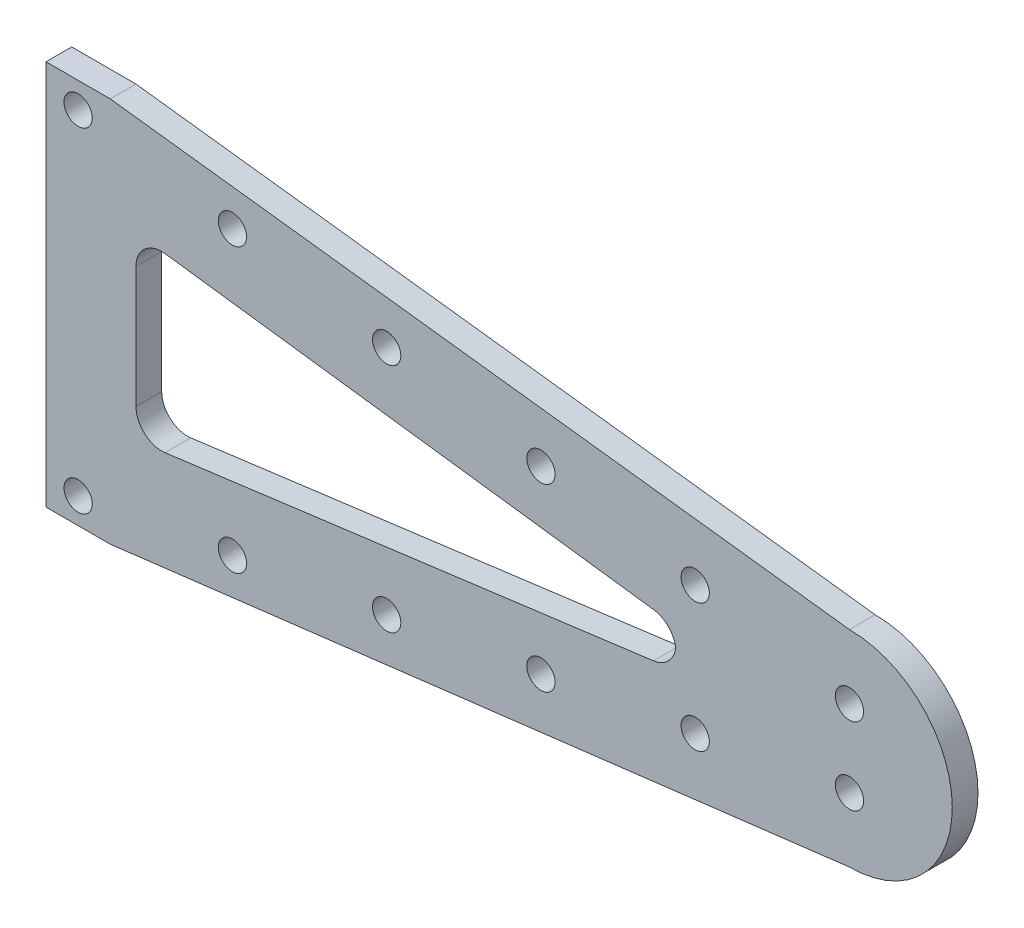
ISO-10303-21;
HEADER;
FILE_DESCRIPTION(('STEP AP214'),'2;1');
FILE_NAME('part.step','',(''),(''),'','','');
FILE_SCHEMA(('AUTOMOTIVE_DESIGN { 1 0 10303 214 1 1 1 1 }'));
ENDSEC;
DATA;
#1=APPLICATION_CONTEXT('core data for automotive mechanical design processes');
#2=APPLICATION_PROTOCOL_DEFINITION('international standard','automotive_design',2000,#1);
#3=PRODUCT_CONTEXT('',#1,'mechanical');
#4=PRODUCT('Part','Part','',(#3));
#5=PRODUCT_RELATED_PRODUCT_CATEGORY('part','',(#4));
#6=PRODUCT_DEFINITION_FORMATION('','',#4);
#7=PRODUCT_DEFINITION_CONTEXT('part definition',#1,'design');
#8=PRODUCT_DEFINITION('design','',#6,#7);
#9=PRODUCT_DEFINITION_SHAPE('','',#8);
#10=(LENGTH_UNIT() NAMED_UNIT(*) SI_UNIT(.MILLI.,.METRE.));
#11=(NAMED_UNIT(*) PLANE_ANGLE_UNIT() SI_UNIT($,.RADIAN.));
#12=(NAMED_UNIT(*) SI_UNIT($,.STERADIAN.) SOLID_ANGLE_UNIT());
#13=UNCERTAINTY_MEASURE_WITH_UNIT(LENGTH_MEASURE(1.E-05),#10,'distance_accuracy_value','');
#14=(GEOMETRIC_REPRESENTATION_CONTEXT(3) GLOBAL_UNCERTAINTY_ASSIGNED_CONTEXT((#13)) GLOBAL_UNIT_ASSIGNED_CONTEXT((#10,
#11,#12)) REPRESENTATION_CONTEXT('',''));
#15=CARTESIAN_POINT('',(0.,0.,0.));
#16=DIRECTION('',(0.,0.,1.));
#17=DIRECTION('',(1.,0.,0.));
#18=AXIS2_PLACEMENT_3D('',#15,#16,#17);
#19=CARTESIAN_POINT('',(60.,0.,2.));
#20=DIRECTION('',(0.,0.,1.));
#21=DIRECTION('',(1.,0.,0.));
#22=AXIS2_PLACEMENT_3D('',#19,#20,#21);
#23=PLANE('',#22);
#24=CARTESIAN_POINT('',(12.,-11.,2.));
#25=DIRECTION('',(0.,0.,1.));
#26=DIRECTION('',(-1.,0.,0.));
#27=AXIS2_PLACEMENT_3D('',#24,#25,#26);
#28=CIRCLE('',#27,1.1);
#29=CARTESIAN_POINT('',(10.9,-11.,2.));
#30=VERTEX_POINT('',#29);
#31=EDGE_CURVE('E211',#30,#30,#28,.T.);
#32=ORIENTED_EDGE('',*,*,#31,.F.);
#33=EDGE_LOOP('',(#32));
#34=FACE_BOUND('',#33,.T.);
#35=CARTESIAN_POINT('',(36.,-6.99999999999999,2.));
#36=DIRECTION('',(0.,0.,1.));
#37=DIRECTION('',(-1.,0.,0.));
#38=AXIS2_PLACEMENT_3D('',#35,#36,#37);
#39=CIRCLE('',#38,1.1);
#40=CARTESIAN_POINT('',(34.9,-6.99999999999999,2.));
#41=VERTEX_POINT('',#40);
#42=EDGE_CURVE('E229',#41,#41,#39,.T.);
#43=ORIENTED_EDGE('',*,*,#42,.F.);
#44=EDGE_LOOP('',(#43));
#45=FACE_BOUND('',#44,.T.);
#46=CARTESIAN_POINT('',(60.,-3.,2.));
#47=DIRECTION('',(0.,0.,1.));
#48=DIRECTION('',(-1.,0.,0.));
#49=AXIS2_PLACEMENT_3D('',#46,#47,#48);
#50=CIRCLE('',#49,1.1);
#51=CARTESIAN_POINT('',(58.9,-3.,2.));
#52=VERTEX_POINT('',#51);
#53=EDGE_CURVE('E241',#52,#52,#50,.T.);
#54=ORIENTED_EDGE('',*,*,#53,.F.);
#55=EDGE_LOOP('',(#54));
#56=FACE_BOUND('',#55,.T.);
#57=CARTESIAN_POINT('',(48.,5.,2.));
#58=DIRECTION('',(0.,0.,1.));
#59=DIRECTION('',(1.,0.,0.));
#60=AXIS2_PLACEMENT_3D('',#57,#58,#59);
#61=CIRCLE('',#60,1.1);
#62=CARTESIAN_POINT('',(49.1,5.,2.));
#63=VERTEX_POINT('',#62);
#64=EDGE_CURVE('E253',#63,#63,#61,.T.);
#65=ORIENTED_EDGE('',*,*,#64,.F.);
#66=EDGE_LOOP('',(#65));
#67=FACE_BOUND('',#66,.T.);
#68=CARTESIAN_POINT('',(24.,9.,2.));
#69=DIRECTION('',(0.,0.,1.));
#70=DIRECTION('',(1.,0.,0.));
#71=AXIS2_PLACEMENT_3D('',#68,#69,#70);
#72=CIRCLE('',#71,1.1);
#73=CARTESIAN_POINT('',(25.1,9.,2.));
#74=VERTEX_POINT('',#73);
#75=EDGE_CURVE('E265',#74,#74,#72,.T.);
#76=ORIENTED_EDGE('',*,*,#75,.F.);
#77=EDGE_LOOP('',(#76));
#78=FACE_BOUND('',#77,.T.);
#79=CARTESIAN_POINT('',(0.,-13.,2.));
#80=DIRECTION('',(0.,0.,1.));
#81=DIRECTION('',(1.,0.,0.));
#82=AXIS2_PLACEMENT_3D('',#79,#80,#81);
#83=CIRCLE('',#82,1.1);
#84=CARTESIAN_POINT('',(1.1,-13.,2.));
#85=VERTEX_POINT('',#84);
#86=EDGE_CURVE('E277',#85,#85,#83,.T.);
#87=ORIENTED_EDGE('',*,*,#86,.F.);
#88=EDGE_LOOP('',(#87));
#89=FACE_BOUND('',#88,.T.);
#90=DIRECTION('',(0.992671154592933,0.120846923167835,0.));
#91=VECTOR('',#90,1.);
#92=CARTESIAN_POINT('',(2.5,-15.,2.));
#93=LINE('',#92,#91);
#94=CARTESIAN_POINT('',(2.5,-15.,2.));
#95=VERTEX_POINT('',#94);
#96=CARTESIAN_POINT('',(60.,-8.00000000000001,2.));
#97=VERTEX_POINT('',#96);
#98=EDGE_CURVE('E140',#95,#97,#93,.T.);
#99=ORIENTED_EDGE('',*,*,#98,.T.);
#100=CARTESIAN_POINT('',(60.,0.,2.));
#101=DIRECTION('',(0.,0.,1.));
#102=DIRECTION('',(1.,0.,0.));
#103=AXIS2_PLACEMENT_3D('',#100,#101,#102);
#104=CIRCLE('',#103,8.00000000000001);
#105=CARTESIAN_POINT('',(60.,8.00000000000001,2.));
#106=VERTEX_POINT('',#105);
#107=EDGE_CURVE('E129',#97,#106,#104,.T.);
#108=ORIENTED_EDGE('',*,*,#107,.T.);
#109=DIRECTION('',(-0.992671154592933,0.120846923167835,0.));
#110=VECTOR('',#109,1.);
#111=CARTESIAN_POINT('',(2.5,15.,2.));
#112=LINE('',#111,#110);
#113=CARTESIAN_POINT('',(2.5,15.,2.));
#114=VERTEX_POINT('',#113);
#115=EDGE_CURVE('E139',#106,#114,#112,.T.);
#116=ORIENTED_EDGE('',*,*,#115,.T.);
#117=DIRECTION('',(-1.,0.,0.));
#118=VECTOR('',#117,1.);
#119=CARTESIAN_POINT('',(-2.5,15.,2.));
#120=LINE('',#119,#118);
#121=CARTESIAN_POINT('',(-2.5,15.,2.));
#122=VERTEX_POINT('',#121);
#123=EDGE_CURVE('E289',#114,#122,#120,.T.);
#124=ORIENTED_EDGE('',*,*,#123,.T.);
#125=DIRECTION('',(0.,-1.,0.));
#126=VECTOR('',#125,1.);
#127=CARTESIAN_POINT('',(-2.5,15.,2.));
#128=LINE('',#127,#126);
#129=CARTESIAN_POINT('',(-2.5,-15.,2.));
#130=VERTEX_POINT('',#129);
#131=EDGE_CURVE('E291',#122,#130,#128,.T.);
#132=ORIENTED_EDGE('',*,*,#131,.T.);
#133=DIRECTION('',(1.,0.,0.));
#134=VECTOR('',#133,1.);
#135=CARTESIAN_POINT('',(-2.5,-15.,2.));
#136=LINE('',#135,#134);
#137=EDGE_CURVE('E145',#130,#95,#136,.T.);
#138=ORIENTED_EDGE('',*,*,#137,.T.);
#139=EDGE_LOOP('',(#99,#108,#116,#124,#132,#138));
#140=FACE_BOUND('',#139,.T.);
#141=CARTESIAN_POINT('',(0.,13.,2.));
#142=DIRECTION('',(0.,0.,1.));
#143=DIRECTION('',(1.,0.,0.));
#144=AXIS2_PLACEMENT_3D('',#141,#142,#143);
#145=CIRCLE('',#144,1.1);
#146=CARTESIAN_POINT('',(1.1,13.,2.));
#147=VERTEX_POINT('',#146);
#148=EDGE_CURVE('E283',#147,#147,#145,.T.);
#149=ORIENTED_EDGE('',*,*,#148,.F.);
#150=EDGE_LOOP('',(#149));
#151=FACE_BOUND('',#150,.T.);
#152=CARTESIAN_POINT('',(12.,11.,2.));
#153=DIRECTION('',(0.,0.,1.));
#154=DIRECTION('',(1.,0.,0.));
#155=AXIS2_PLACEMENT_3D('',#152,#153,#154);
#156=CIRCLE('',#155,1.1);
#157=CARTESIAN_POINT('',(13.1,11.,2.));
#158=VERTEX_POINT('',#157);
#159=EDGE_CURVE('E271',#158,#158,#156,.T.);
#160=ORIENTED_EDGE('',*,*,#159,.F.);
#161=EDGE_LOOP('',(#160));
#162=FACE_BOUND('',#161,.T.);
#163=CARTESIAN_POINT('',(36.,7.,2.));
#164=DIRECTION('',(0.,0.,1.));
#165=DIRECTION('',(1.,0.,0.));
#166=AXIS2_PLACEMENT_3D('',#163,#164,#165);
#167=CIRCLE('',#166,1.1);
#168=CARTESIAN_POINT('',(37.1,7.,2.));
#169=VERTEX_POINT('',#168);
#170=EDGE_CURVE('E259',#169,#169,#167,.T.);
#171=ORIENTED_EDGE('',*,*,#170,.F.);
#172=EDGE_LOOP('',(#171));
#173=FACE_BOUND('',#172,.T.);
#174=CARTESIAN_POINT('',(60.,3.,2.));
#175=DIRECTION('',(0.,0.,1.));
#176=DIRECTION('',(1.,0.,0.));
#177=AXIS2_PLACEMENT_3D('',#174,#175,#176);
#178=CIRCLE('',#177,1.1);
#179=CARTESIAN_POINT('',(61.1,3.,2.));
#180=VERTEX_POINT('',#179);
#181=EDGE_CURVE('E247',#180,#180,#178,.T.);
#182=ORIENTED_EDGE('',*,*,#181,.F.);
#183=EDGE_LOOP('',(#182));
#184=FACE_BOUND('',#183,.T.);
#185=CARTESIAN_POINT('',(48.,-5.,2.));
#186=DIRECTION('',(0.,0.,1.));
#187=DIRECTION('',(-1.,0.,0.));
#188=AXIS2_PLACEMENT_3D('',#185,#186,#187);
#189=CIRCLE('',#188,1.1);
#190=CARTESIAN_POINT('',(46.9,-5.,2.));
#191=VERTEX_POINT('',#190);
#192=EDGE_CURVE('E235',#191,#191,#189,.T.);
#193=ORIENTED_EDGE('',*,*,#192,.F.);
#194=EDGE_LOOP('',(#193));
#195=FACE_BOUND('',#194,.T.);
#196=CARTESIAN_POINT('',(24.,-8.99999999999999,2.));
#197=DIRECTION('',(0.,0.,1.));
#198=DIRECTION('',(-1.,0.,0.));
#199=AXIS2_PLACEMENT_3D('',#196,#197,#198);
#200=CIRCLE('',#199,1.1);
#201=CARTESIAN_POINT('',(22.9,-8.99999999999999,2.));
#202=VERTEX_POINT('',#201);
#203=EDGE_CURVE('E223',#202,#202,#200,.T.);
#204=ORIENTED_EDGE('',*,*,#203,.F.);
#205=EDGE_LOOP('',(#204));
#206=FACE_BOUND('',#205,.T.);
#207=DIRECTION('',(-0.991534461322152,0.129843798506472,0.));
#208=VECTOR('',#207,1.);
#209=CARTESIAN_POINT('',(4.5,6.99999999999999,2.));
#210=LINE('',#209,#208);
#211=CARTESIAN_POINT('',(44.7596875970129,1.72789805277211,2.));
#212=VERTEX_POINT('',#211);
#213=CARTESIAN_POINT('',(6.75968759701294,6.70408852896258,2.));
#214=VERTEX_POINT('',#213);
#215=EDGE_CURVE('E203',#212,#214,#210,.T.);
#216=ORIENTED_EDGE('',*,*,#215,.F.);
#217=CARTESIAN_POINT('',(44.5,-0.25517086987219,2.));
#218=DIRECTION('',(0.,0.,1.));
#219=DIRECTION('',(1.,0.,0.));
#220=AXIS2_PLACEMENT_3D('',#217,#218,#219);
#221=CIRCLE('',#220,2.);
#222=CARTESIAN_POINT('',(46.4836551684123,0.,2.));
#223=VERTEX_POINT('',#222);
#224=EDGE_CURVE('E49',#212,#223,#221,.F.);
#225=ORIENTED_EDGE('',*,*,#224,.T.);
#226=CARTESIAN_POINT('',(44.5,0.25517086987219,2.));
#227=DIRECTION('',(0.,0.,1.));
#228=DIRECTION('',(1.,0.,0.));
#229=AXIS2_PLACEMENT_3D('',#226,#227,#228);
#230=CIRCLE('',#229,2.);
#231=CARTESIAN_POINT('',(44.7596875970129,-1.72789805277211,2.));
#232=VERTEX_POINT('',#231);
#233=EDGE_CURVE('E175',#223,#232,#230,.F.);
#234=ORIENTED_EDGE('',*,*,#233,.T.);
#235=DIRECTION('',(0.991534461322152,0.129843798506472,0.));
#236=VECTOR('',#235,1.);
#237=CARTESIAN_POINT('',(46.5,-1.5,2.));
#238=LINE('',#237,#236);
#239=CARTESIAN_POINT('',(6.75968759701294,-6.70408852896259,2.));
#240=VERTEX_POINT('',#239);
#241=EDGE_CURVE('E208',#240,#232,#238,.T.);
#242=ORIENTED_EDGE('',*,*,#241,.F.);
#243=CARTESIAN_POINT('',(6.5,-4.72101960631829,2.));
#244=DIRECTION('',(0.,0.,1.));
#245=DIRECTION('',(1.,0.,0.));
#246=AXIS2_PLACEMENT_3D('',#243,#244,#245);
#247=CIRCLE('',#246,2.);
#248=CARTESIAN_POINT('',(4.5,-4.72101960631829,2.));
#249=VERTEX_POINT('',#248);
#250=EDGE_CURVE('E182',#240,#249,#247,.F.);
#251=ORIENTED_EDGE('',*,*,#250,.T.);
#252=DIRECTION('',(0.,-1.,0.));
#253=VECTOR('',#252,1.);
#254=CARTESIAN_POINT('',(4.5,-7.,2.));
#255=LINE('',#254,#253);
#256=CARTESIAN_POINT('',(4.5,4.72101960631828,2.));
#257=VERTEX_POINT('',#256);
#258=EDGE_CURVE('E199',#257,#249,#255,.T.);
#259=ORIENTED_EDGE('',*,*,#258,.F.);
#260=CARTESIAN_POINT('',(6.5,4.72101960631828,2.));
#261=DIRECTION('',(0.,0.,1.));
#262=DIRECTION('',(1.,0.,0.));
#263=AXIS2_PLACEMENT_3D('',#260,#261,#262);
#264=CIRCLE('',#263,2.);
#265=EDGE_CURVE('E11',#257,#214,#264,.F.);
#266=ORIENTED_EDGE('',*,*,#265,.T.);
#267=EDGE_LOOP('',(#216,#225,#234,#242,#251,#259,#266));
#268=FACE_BOUND('',#267,.T.);
#269=ADVANCED_FACE('F33',(#34,#45,#56,#67,#78,#89,#140,#151,#162,#173,#184,#195,#206,#268),#23,.T.);
#270=CARTESIAN_POINT('',(60.,0.,0.));
#271=DIRECTION('',(0.,0.,1.));
#272=DIRECTION('',(1.,0.,0.));
#273=AXIS2_PLACEMENT_3D('',#270,#271,#272);
#274=PLANE('',#273);
#275=CARTESIAN_POINT('',(12.,-11.,0.));
#276=DIRECTION('',(0.,0.,1.));
#277=DIRECTION('',(-1.,0.,0.));
#278=AXIS2_PLACEMENT_3D('',#275,#276,#277);
#279=CIRCLE('',#278,1.1);
#280=CARTESIAN_POINT('',(10.9,-11.,0.));
#281=VERTEX_POINT('',#280);
#282=EDGE_CURVE('E207',#281,#281,#279,.T.);
#283=ORIENTED_EDGE('',*,*,#282,.T.);
#284=EDGE_LOOP('',(#283));
#285=FACE_BOUND('',#284,.T.);
#286=CARTESIAN_POINT('',(36.,-6.99999999999999,0.));
#287=DIRECTION('',(0.,0.,1.));
#288=DIRECTION('',(-1.,0.,0.));
#289=AXIS2_PLACEMENT_3D('',#286,#287,#288);
#290=CIRCLE('',#289,1.1);
#291=CARTESIAN_POINT('',(34.9,-6.99999999999999,0.));
#292=VERTEX_POINT('',#291);
#293=EDGE_CURVE('E226',#292,#292,#290,.T.);
#294=ORIENTED_EDGE('',*,*,#293,.T.);
#295=EDGE_LOOP('',(#294));
#296=FACE_BOUND('',#295,.T.);
#297=CARTESIAN_POINT('',(60.,-3.,0.));
#298=DIRECTION('',(0.,0.,1.));
#299=DIRECTION('',(-1.,0.,0.));
#300=AXIS2_PLACEMENT_3D('',#297,#298,#299);
#301=CIRCLE('',#300,1.1);
#302=CARTESIAN_POINT('',(58.9,-3.,0.));
#303=VERTEX_POINT('',#302);
#304=EDGE_CURVE('E238',#303,#303,#301,.T.);
#305=ORIENTED_EDGE('',*,*,#304,.T.);
#306=EDGE_LOOP('',(#305));
#307=FACE_BOUND('',#306,.T.);
#308=CARTESIAN_POINT('',(48.,5.,0.));
#309=DIRECTION('',(0.,0.,1.));
#310=DIRECTION('',(1.,0.,0.));
#311=AXIS2_PLACEMENT_3D('',#308,#309,#310);
#312=CIRCLE('',#311,1.1);
#313=CARTESIAN_POINT('',(49.1,5.,0.));
#314=VERTEX_POINT('',#313);
#315=EDGE_CURVE('E250',#314,#314,#312,.T.);
#316=ORIENTED_EDGE('',*,*,#315,.T.);
#317=EDGE_LOOP('',(#316));
#318=FACE_BOUND('',#317,.T.);
#319=CARTESIAN_POINT('',(24.,9.,0.));
#320=DIRECTION('',(0.,0.,1.));
#321=DIRECTION('',(1.,0.,0.));
#322=AXIS2_PLACEMENT_3D('',#319,#320,#321);
#323=CIRCLE('',#322,1.1);
#324=CARTESIAN_POINT('',(25.1,9.,0.));
#325=VERTEX_POINT('',#324);
#326=EDGE_CURVE('E262',#325,#325,#323,.T.);
#327=ORIENTED_EDGE('',*,*,#326,.T.);
#328=EDGE_LOOP('',(#327));
#329=FACE_BOUND('',#328,.T.);
#330=CARTESIAN_POINT('',(0.,-13.,0.));
#331=DIRECTION('',(0.,0.,1.));
#332=DIRECTION('',(1.,0.,0.));
#333=AXIS2_PLACEMENT_3D('',#330,#331,#332);
#334=CIRCLE('',#333,1.1);
#335=CARTESIAN_POINT('',(1.1,-13.,0.));
#336=VERTEX_POINT('',#335);
#337=EDGE_CURVE('E274',#336,#336,#334,.T.);
#338=ORIENTED_EDGE('',*,*,#337,.T.);
#339=EDGE_LOOP('',(#338));
#340=FACE_BOUND('',#339,.T.);
#341=DIRECTION('',(0.992671154592933,0.120846923167835,0.));
#342=VECTOR('',#341,1.);
#343=CARTESIAN_POINT('',(2.5,-15.,0.));
#344=LINE('',#343,#342);
#345=CARTESIAN_POINT('',(2.5,-15.,0.));
#346=VERTEX_POINT('',#345);
#347=CARTESIAN_POINT('',(60.,-8.00000000000001,0.));
#348=VERTEX_POINT('',#347);
#349=EDGE_CURVE('E153',#346,#348,#344,.T.);
#350=ORIENTED_EDGE('',*,*,#349,.F.);
#351=DIRECTION('',(1.,0.,0.));
#352=VECTOR('',#351,1.);
#353=CARTESIAN_POINT('',(-2.5,-15.,0.));
#354=LINE('',#353,#352);
#355=CARTESIAN_POINT('',(-2.5,-15.,0.));
#356=VERTEX_POINT('',#355);
#357=EDGE_CURVE('E149',#356,#346,#354,.T.);
#358=ORIENTED_EDGE('',*,*,#357,.F.);
#359=DIRECTION('',(0.,-1.,0.));
#360=VECTOR('',#359,1.);
#361=CARTESIAN_POINT('',(-2.5,15.,0.));
#362=LINE('',#361,#360);
#363=CARTESIAN_POINT('',(-2.5,15.,0.));
#364=VERTEX_POINT('',#363);
#365=EDGE_CURVE('E302',#364,#356,#362,.T.);
#366=ORIENTED_EDGE('',*,*,#365,.F.);
#367=DIRECTION('',(-1.,0.,0.));
#368=VECTOR('',#367,1.);
#369=CARTESIAN_POINT('',(-2.5,15.,0.));
#370=LINE('',#369,#368);
#371=CARTESIAN_POINT('',(2.5,15.,0.));
#372=VERTEX_POINT('',#371);
#373=EDGE_CURVE('E300',#372,#364,#370,.T.);
#374=ORIENTED_EDGE('',*,*,#373,.F.);
#375=DIRECTION('',(-0.992671154592933,0.120846923167835,0.));
#376=VECTOR('',#375,1.);
#377=CARTESIAN_POINT('',(2.5,15.,0.));
#378=LINE('',#377,#376);
#379=CARTESIAN_POINT('',(60.,8.00000000000001,0.));
#380=VERTEX_POINT('',#379);
#381=EDGE_CURVE('E298',#380,#372,#378,.T.);
#382=ORIENTED_EDGE('',*,*,#381,.F.);
#383=CARTESIAN_POINT('',(60.,0.,0.));
#384=DIRECTION('',(0.,0.,1.));
#385=DIRECTION('',(1.,0.,0.));
#386=AXIS2_PLACEMENT_3D('',#383,#384,#385);
#387=CIRCLE('',#386,8.00000000000001);
#388=EDGE_CURVE('E296',#348,#380,#387,.T.);
#389=ORIENTED_EDGE('',*,*,#388,.F.);
#390=EDGE_LOOP('',(#350,#358,#366,#374,#382,#389));
#391=FACE_BOUND('',#390,.T.);
#392=CARTESIAN_POINT('',(0.,13.,0.));
#393=DIRECTION('',(0.,0.,1.));
#394=DIRECTION('',(1.,0.,0.));
#395=AXIS2_PLACEMENT_3D('',#392,#393,#394);
#396=CIRCLE('',#395,1.1);
#397=CARTESIAN_POINT('',(1.1,13.,0.));
#398=VERTEX_POINT('',#397);
#399=EDGE_CURVE('E280',#398,#398,#396,.T.);
#400=ORIENTED_EDGE('',*,*,#399,.T.);
#401=EDGE_LOOP('',(#400));
#402=FACE_BOUND('',#401,.T.);
#403=CARTESIAN_POINT('',(12.,11.,0.));
#404=DIRECTION('',(0.,0.,1.));
#405=DIRECTION('',(1.,0.,0.));
#406=AXIS2_PLACEMENT_3D('',#403,#404,#405);
#407=CIRCLE('',#406,1.1);
#408=CARTESIAN_POINT('',(13.1,11.,0.));
#409=VERTEX_POINT('',#408);
#410=EDGE_CURVE('E268',#409,#409,#407,.T.);
#411=ORIENTED_EDGE('',*,*,#410,.T.);
#412=EDGE_LOOP('',(#411));
#413=FACE_BOUND('',#412,.T.);
#414=CARTESIAN_POINT('',(36.,7.,0.));
#415=DIRECTION('',(0.,0.,1.));
#416=DIRECTION('',(1.,0.,0.));
#417=AXIS2_PLACEMENT_3D('',#414,#415,#416);
#418=CIRCLE('',#417,1.1);
#419=CARTESIAN_POINT('',(37.1,7.,0.));
#420=VERTEX_POINT('',#419);
#421=EDGE_CURVE('E256',#420,#420,#418,.T.);
#422=ORIENTED_EDGE('',*,*,#421,.T.);
#423=EDGE_LOOP('',(#422));
#424=FACE_BOUND('',#423,.T.);
#425=CARTESIAN_POINT('',(60.,3.,0.));
#426=DIRECTION('',(0.,0.,1.));
#427=DIRECTION('',(1.,0.,0.));
#428=AXIS2_PLACEMENT_3D('',#425,#426,#427);
#429=CIRCLE('',#428,1.1);
#430=CARTESIAN_POINT('',(61.1,3.,0.));
#431=VERTEX_POINT('',#430);
#432=EDGE_CURVE('E244',#431,#431,#429,.T.);
#433=ORIENTED_EDGE('',*,*,#432,.T.);
#434=EDGE_LOOP('',(#433));
#435=FACE_BOUND('',#434,.T.);
#436=CARTESIAN_POINT('',(48.,-5.,0.));
#437=DIRECTION('',(0.,0.,1.));
#438=DIRECTION('',(-1.,0.,0.));
#439=AXIS2_PLACEMENT_3D('',#436,#437,#438);
#440=CIRCLE('',#439,1.1);
#441=CARTESIAN_POINT('',(46.9,-5.,0.));
#442=VERTEX_POINT('',#441);
#443=EDGE_CURVE('E232',#442,#442,#440,.T.);
#444=ORIENTED_EDGE('',*,*,#443,.T.);
#445=EDGE_LOOP('',(#444));
#446=FACE_BOUND('',#445,.T.);
#447=CARTESIAN_POINT('',(24.,-8.99999999999999,0.));
#448=DIRECTION('',(0.,0.,1.));
#449=DIRECTION('',(-1.,0.,0.));
#450=AXIS2_PLACEMENT_3D('',#447,#448,#449);
#451=CIRCLE('',#450,1.1);
#452=CARTESIAN_POINT('',(22.9,-8.99999999999999,0.));
#453=VERTEX_POINT('',#452);
#454=EDGE_CURVE('E221',#453,#453,#451,.T.);
#455=ORIENTED_EDGE('',*,*,#454,.T.);
#456=EDGE_LOOP('',(#455));
#457=FACE_BOUND('',#456,.T.);
#458=DIRECTION('',(0.,-1.,0.));
#459=VECTOR('',#458,1.);
#460=CARTESIAN_POINT('',(4.5,0.,0.));
#461=LINE('',#460,#459);
#462=CARTESIAN_POINT('',(4.5,4.72101960631828,0.));
#463=VERTEX_POINT('',#462);
#464=CARTESIAN_POINT('',(4.5,-4.72101960631829,0.));
#465=VERTEX_POINT('',#464);
#466=EDGE_CURVE('E188',#463,#465,#461,.T.);
#467=ORIENTED_EDGE('',*,*,#466,.T.);
#468=CARTESIAN_POINT('',(6.5,-4.72101960631829,0.));
#469=DIRECTION('',(0.,0.,1.));
#470=DIRECTION('',(1.,0.,0.));
#471=AXIS2_PLACEMENT_3D('',#468,#469,#470);
#472=CIRCLE('',#471,2.);
#473=CARTESIAN_POINT('',(6.75968759701294,-6.70408852896259,0.));
#474=VERTEX_POINT('',#473);
#475=EDGE_CURVE('E180',#465,#474,#472,.T.);
#476=ORIENTED_EDGE('',*,*,#475,.T.);
#477=DIRECTION('',(0.991534461322152,0.129843798506472,0.));
#478=VECTOR('',#477,1.);
#479=CARTESIAN_POINT('',(46.5,-1.5,0.));
#480=LINE('',#479,#478);
#481=CARTESIAN_POINT('',(44.7596875970129,-1.72789805277211,0.));
#482=VERTEX_POINT('',#481);
#483=EDGE_CURVE('E217',#474,#482,#480,.T.);
#484=ORIENTED_EDGE('',*,*,#483,.T.);
#485=CARTESIAN_POINT('',(44.5,0.25517086987219,0.));
#486=DIRECTION('',(0.,0.,1.));
#487=DIRECTION('',(1.,0.,0.));
#488=AXIS2_PLACEMENT_3D('',#485,#486,#487);
#489=CIRCLE('',#488,2.);
#490=CARTESIAN_POINT('',(46.4836551684123,0.,0.));
#491=VERTEX_POINT('',#490);
#492=EDGE_CURVE('E57',#482,#491,#489,.T.);
#493=ORIENTED_EDGE('',*,*,#492,.T.);
#494=CARTESIAN_POINT('',(44.5,-0.25517086987219,0.));
#495=DIRECTION('',(0.,0.,1.));
#496=DIRECTION('',(1.,0.,0.));
#497=AXIS2_PLACEMENT_3D('',#494,#495,#496);
#498=CIRCLE('',#497,2.);
#499=CARTESIAN_POINT('',(44.7596875970129,1.72789805277211,0.));
#500=VERTEX_POINT('',#499);
#501=EDGE_CURVE('E177',#491,#500,#498,.T.);
#502=ORIENTED_EDGE('',*,*,#501,.T.);
#503=DIRECTION('',(-0.991534461322152,0.129843798506472,0.));
#504=VECTOR('',#503,1.);
#505=CARTESIAN_POINT('',(4.5,6.99999999999999,0.));
#506=LINE('',#505,#504);
#507=CARTESIAN_POINT('',(6.75968759701294,6.70408852896258,0.));
#508=VERTEX_POINT('',#507);
#509=EDGE_CURVE('E190',#500,#508,#506,.T.);
#510=ORIENTED_EDGE('',*,*,#509,.T.);
#511=CARTESIAN_POINT('',(6.5,4.72101960631828,0.));
#512=DIRECTION('',(0.,0.,1.));
#513=DIRECTION('',(1.,0.,0.));
#514=AXIS2_PLACEMENT_3D('',#511,#512,#513);
#515=CIRCLE('',#514,2.);
#516=EDGE_CURVE('E42',#508,#463,#515,.T.);
#517=ORIENTED_EDGE('',*,*,#516,.T.);
#518=EDGE_LOOP('',(#467,#476,#484,#493,#502,#510,#517));
#519=FACE_BOUND('',#518,.T.);
#520=ADVANCED_FACE('F187',(#285,#296,#307,#318,#329,#340,#391,#402,#413,#424,#435,#446,#457,
#519),#274,.F.);
#521=CARTESIAN_POINT('',(2.5,-15.,2.));
#522=DIRECTION('',(-0.120846923167835,0.992671154592933,0.));
#523=DIRECTION('',(-0.992671154592933,-0.120846923167835,0.));
#524=AXIS2_PLACEMENT_3D('',#521,#522,#523);
#525=PLANE('',#524);
#526=ORIENTED_EDGE('',*,*,#349,.T.);
#527=DIRECTION('',(0.,0.,-1.));
#528=VECTOR('',#527,1.);
#529=CARTESIAN_POINT('',(60.,-8.00000000000001,2.));
#530=LINE('',#529,#528);
#531=EDGE_CURVE('E133',#97,#348,#530,.T.);
#532=ORIENTED_EDGE('',*,*,#531,.F.);
#533=ORIENTED_EDGE('',*,*,#98,.F.);
#534=DIRECTION('',(0.,0.,-1.));
#535=VECTOR('',#534,1.);
#536=CARTESIAN_POINT('',(2.5,-15.,2.));
#537=LINE('',#536,#535);
#538=EDGE_CURVE('E294',#95,#346,#537,.T.);
#539=ORIENTED_EDGE('',*,*,#538,.T.);
#540=EDGE_LOOP('',(#526,#532,#533,#539));
#541=FACE_BOUND('',#540,.T.);
#542=ADVANCED_FACE('F151',(#541),#525,.F.);
#543=CARTESIAN_POINT('',(60.,0.,2.));
#544=DIRECTION('',(0.,0.,-1.));
#545=DIRECTION('',(-1.,0.,0.));
#546=AXIS2_PLACEMENT_3D('',#543,#544,#545);
#547=CYLINDRICAL_SURFACE('',#546,8.00000000000001);
#548=ORIENTED_EDGE('',*,*,#388,.T.);
#549=DIRECTION('',(0.,0.,-1.));
#550=VECTOR('',#549,1.);
#551=CARTESIAN_POINT('',(60.,8.00000000000001,2.));
#552=LINE('',#551,#550);
#553=EDGE_CURVE('E136',#106,#380,#552,.T.);
#554=ORIENTED_EDGE('',*,*,#553,.F.);
#555=ORIENTED_EDGE('',*,*,#107,.F.);
#556=ORIENTED_EDGE('',*,*,#531,.T.);
#557=EDGE_LOOP('',(#548,#554,#555,#556));
#558=FACE_BOUND('',#557,.T.);
#559=ADVANCED_FACE('F131',(#558),#547,.T.);
#560=CARTESIAN_POINT('',(2.5,15.,2.));
#561=DIRECTION('',(-0.120846923167835,-0.992671154592933,0.));
#562=DIRECTION('',(0.992671154592933,-0.120846923167835,0.));
#563=AXIS2_PLACEMENT_3D('',#560,#561,#562);
#564=PLANE('',#563);
#565=ORIENTED_EDGE('',*,*,#381,.T.);
#566=DIRECTION('',(0.,0.,-1.));
#567=VECTOR('',#566,1.);
#568=CARTESIAN_POINT('',(2.5,15.,2.));
#569=LINE('',#568,#567);
#570=EDGE_CURVE('E158',#114,#372,#569,.T.);
#571=ORIENTED_EDGE('',*,*,#570,.F.);
#572=ORIENTED_EDGE('',*,*,#115,.F.);
#573=ORIENTED_EDGE('',*,*,#553,.T.);
#574=EDGE_LOOP('',(#565,#571,#572,#573));
#575=FACE_BOUND('',#574,.T.);
#576=ADVANCED_FACE('F330',(#575),#564,.F.);
#577=CARTESIAN_POINT('',(-2.5,15.,2.));
#578=DIRECTION('',(0.,-1.,0.));
#579=DIRECTION('',(0.,0.,-1.));
#580=AXIS2_PLACEMENT_3D('',#577,#578,#579);
#581=PLANE('',#580);
#582=ORIENTED_EDGE('',*,*,#373,.T.);
#583=DIRECTION('',(0.,0.,-1.));
#584=VECTOR('',#583,1.);
#585=CARTESIAN_POINT('',(-2.5,15.,2.));
#586=LINE('',#585,#584);
#587=EDGE_CURVE('E309',#122,#364,#586,.T.);
#588=ORIENTED_EDGE('',*,*,#587,.F.);
#589=ORIENTED_EDGE('',*,*,#123,.F.);
#590=ORIENTED_EDGE('',*,*,#570,.T.);
#591=EDGE_LOOP('',(#582,#588,#589,#590));
#592=FACE_BOUND('',#591,.T.);
#593=ADVANCED_FACE('F316',(#592),#581,.F.);
#594=CARTESIAN_POINT('',(-2.5,15.,2.));
#595=DIRECTION('',(1.,0.,0.));
#596=DIRECTION('',(0.,1.,0.));
#597=AXIS2_PLACEMENT_3D('',#594,#595,#596);
#598=PLANE('',#597);
#599=ORIENTED_EDGE('',*,*,#365,.T.);
#600=DIRECTION('',(0.,0.,-1.));
#601=VECTOR('',#600,1.);
#602=CARTESIAN_POINT('',(-2.5,-15.,2.));
#603=LINE('',#602,#601);
#604=EDGE_CURVE('E306',#130,#356,#603,.T.);
#605=ORIENTED_EDGE('',*,*,#604,.F.);
#606=ORIENTED_EDGE('',*,*,#131,.F.);
#607=ORIENTED_EDGE('',*,*,#587,.T.);
#608=EDGE_LOOP('',(#599,#605,#606,#607));
#609=FACE_BOUND('',#608,.T.);
#610=ADVANCED_FACE('F326',(#609),#598,.F.);
#611=CARTESIAN_POINT('',(-2.5,-15.,2.));
#612=DIRECTION('',(0.,1.,0.));
#613=DIRECTION('',(0.,0.,1.));
#614=AXIS2_PLACEMENT_3D('',#611,#612,#613);
#615=PLANE('',#614);
#616=ORIENTED_EDGE('',*,*,#357,.T.);
#617=ORIENTED_EDGE('',*,*,#538,.F.);
#618=ORIENTED_EDGE('',*,*,#137,.F.);
#619=ORIENTED_EDGE('',*,*,#604,.T.);
#620=EDGE_LOOP('',(#616,#617,#618,#619));
#621=FACE_BOUND('',#620,.T.);
#622=ADVANCED_FACE('F329',(#621),#615,.F.);
#623=CARTESIAN_POINT('',(0.,13.,2.));
#624=DIRECTION('',(0.,0.,-1.));
#625=DIRECTION('',(-1.,0.,0.));
#626=AXIS2_PLACEMENT_3D('',#623,#624,#625);
#627=CYLINDRICAL_SURFACE('',#626,1.1);
#628=ORIENTED_EDGE('',*,*,#148,.T.);
#629=EDGE_LOOP('',(#628));
#630=FACE_BOUND('',#629,.T.);
#631=ORIENTED_EDGE('',*,*,#399,.F.);
#632=EDGE_LOOP('',(#631));
#633=FACE_BOUND('',#632,.T.);
#634=ADVANCED_FACE('F350',(#630,#633),#627,.F.);
#635=CARTESIAN_POINT('',(0.,-13.,2.));
#636=DIRECTION('',(0.,0.,-1.));
#637=DIRECTION('',(-1.,0.,0.));
#638=AXIS2_PLACEMENT_3D('',#635,#636,#637);
#639=CYLINDRICAL_SURFACE('',#638,1.1);
#640=ORIENTED_EDGE('',*,*,#86,.T.);
#641=EDGE_LOOP('',(#640));
#642=FACE_BOUND('',#641,.T.);
#643=ORIENTED_EDGE('',*,*,#337,.F.);
#644=EDGE_LOOP('',(#643));
#645=FACE_BOUND('',#644,.T.);
#646=ADVANCED_FACE('F370',(#642,#645),#639,.F.);
#647=CARTESIAN_POINT('',(12.,11.,2.));
#648=DIRECTION('',(0.,0.,-1.));
#649=DIRECTION('',(-1.,0.,0.));
#650=AXIS2_PLACEMENT_3D('',#647,#648,#649);
#651=CYLINDRICAL_SURFACE('',#650,1.1);
#652=ORIENTED_EDGE('',*,*,#159,.T.);
#653=EDGE_LOOP('',(#652));
#654=FACE_BOUND('',#653,.T.);
#655=ORIENTED_EDGE('',*,*,#410,.F.);
#656=EDGE_LOOP('',(#655));
#657=FACE_BOUND('',#656,.T.);
#658=ADVANCED_FACE('F377',(#654,#657),#651,.F.);
#659=CARTESIAN_POINT('',(24.,9.,2.));
#660=DIRECTION('',(0.,0.,-1.));
#661=DIRECTION('',(-1.,0.,0.));
#662=AXIS2_PLACEMENT_3D('',#659,#660,#661);
#663=CYLINDRICAL_SURFACE('',#662,1.1);
#664=ORIENTED_EDGE('',*,*,#75,.T.);
#665=EDGE_LOOP('',(#664));
#666=FACE_BOUND('',#665,.T.);
#667=ORIENTED_EDGE('',*,*,#326,.F.);
#668=EDGE_LOOP('',(#667));
#669=FACE_BOUND('',#668,.T.);
#670=ADVANCED_FACE('F384',(#666,#669),#663,.F.);
#671=CARTESIAN_POINT('',(36.,7.,2.));
#672=DIRECTION('',(0.,0.,-1.));
#673=DIRECTION('',(-1.,0.,0.));
#674=AXIS2_PLACEMENT_3D('',#671,#672,#673);
#675=CYLINDRICAL_SURFACE('',#674,1.1);
#676=ORIENTED_EDGE('',*,*,#170,.T.);
#677=EDGE_LOOP('',(#676));
#678=FACE_BOUND('',#677,.T.);
#679=ORIENTED_EDGE('',*,*,#421,.F.);
#680=EDGE_LOOP('',(#679));
#681=FACE_BOUND('',#680,.T.);
#682=ADVANCED_FACE('F392',(#678,#681),#675,.F.);
#683=CARTESIAN_POINT('',(48.,5.,2.));
#684=DIRECTION('',(0.,0.,-1.));
#685=DIRECTION('',(-1.,0.,0.));
#686=AXIS2_PLACEMENT_3D('',#683,#684,#685);
#687=CYLINDRICAL_SURFACE('',#686,1.1);
#688=ORIENTED_EDGE('',*,*,#64,.T.);
#689=EDGE_LOOP('',(#688));
#690=FACE_BOUND('',#689,.T.);
#691=ORIENTED_EDGE('',*,*,#315,.F.);
#692=EDGE_LOOP('',(#691));
#693=FACE_BOUND('',#692,.T.);
#694=ADVANCED_FACE('F400',(#690,#693),#687,.F.);
#695=CARTESIAN_POINT('',(60.,3.,2.));
#696=DIRECTION('',(0.,0.,-1.));
#697=DIRECTION('',(-1.,0.,0.));
#698=AXIS2_PLACEMENT_3D('',#695,#696,#697);
#699=CYLINDRICAL_SURFACE('',#698,1.1);
#700=ORIENTED_EDGE('',*,*,#181,.T.);
#701=EDGE_LOOP('',(#700));
#702=FACE_BOUND('',#701,.T.);
#703=ORIENTED_EDGE('',*,*,#432,.F.);
#704=EDGE_LOOP('',(#703));
#705=FACE_BOUND('',#704,.T.);
#706=ADVANCED_FACE('F408',(#702,#705),#699,.F.);
#707=CARTESIAN_POINT('',(60.,-3.,2.));
#708=DIRECTION('',(0.,0.,-1.));
#709=DIRECTION('',(-1.,0.,0.));
#710=AXIS2_PLACEMENT_3D('',#707,#708,#709);
#711=CYLINDRICAL_SURFACE('',#710,1.1);
#712=ORIENTED_EDGE('',*,*,#53,.T.);
#713=EDGE_LOOP('',(#712));
#714=FACE_BOUND('',#713,.T.);
#715=ORIENTED_EDGE('',*,*,#304,.F.);
#716=EDGE_LOOP('',(#715));
#717=FACE_BOUND('',#716,.T.);
#718=ADVANCED_FACE('F416',(#714,#717),#711,.F.);
#719=CARTESIAN_POINT('',(48.,-5.,2.));
#720=DIRECTION('',(0.,0.,-1.));
#721=DIRECTION('',(-1.,0.,0.));
#722=AXIS2_PLACEMENT_3D('',#719,#720,#721);
#723=CYLINDRICAL_SURFACE('',#722,1.1);
#724=ORIENTED_EDGE('',*,*,#192,.T.);
#725=EDGE_LOOP('',(#724));
#726=FACE_BOUND('',#725,.T.);
#727=ORIENTED_EDGE('',*,*,#443,.F.);
#728=EDGE_LOOP('',(#727));
#729=FACE_BOUND('',#728,.T.);
#730=ADVANCED_FACE('F424',(#726,#729),#723,.F.);
#731=CARTESIAN_POINT('',(36.,-6.99999999999999,2.));
#732=DIRECTION('',(0.,0.,-1.));
#733=DIRECTION('',(-1.,0.,0.));
#734=AXIS2_PLACEMENT_3D('',#731,#732,#733);
#735=CYLINDRICAL_SURFACE('',#734,1.1);
#736=ORIENTED_EDGE('',*,*,#42,.T.);
#737=EDGE_LOOP('',(#736));
#738=FACE_BOUND('',#737,.T.);
#739=ORIENTED_EDGE('',*,*,#293,.F.);
#740=EDGE_LOOP('',(#739));
#741=FACE_BOUND('',#740,.T.);
#742=ADVANCED_FACE('F432',(#738,#741),#735,.F.);
#743=CARTESIAN_POINT('',(24.,-8.99999999999999,2.));
#744=DIRECTION('',(0.,0.,-1.));
#745=DIRECTION('',(-1.,0.,0.));
#746=AXIS2_PLACEMENT_3D('',#743,#744,#745);
#747=CYLINDRICAL_SURFACE('',#746,1.1);
#748=ORIENTED_EDGE('',*,*,#203,.T.);
#749=EDGE_LOOP('',(#748));
#750=FACE_BOUND('',#749,.T.);
#751=ORIENTED_EDGE('',*,*,#454,.F.);
#752=EDGE_LOOP('',(#751));
#753=FACE_BOUND('',#752,.T.);
#754=ADVANCED_FACE('F440',(#750,#753),#747,.F.);
#755=CARTESIAN_POINT('',(12.,-11.,2.));
#756=DIRECTION('',(0.,0.,-1.));
#757=DIRECTION('',(-1.,0.,0.));
#758=AXIS2_PLACEMENT_3D('',#755,#756,#757);
#759=CYLINDRICAL_SURFACE('',#758,1.1);
#760=ORIENTED_EDGE('',*,*,#31,.T.);
#761=EDGE_LOOP('',(#760));
#762=FACE_BOUND('',#761,.T.);
#763=ORIENTED_EDGE('',*,*,#282,.F.);
#764=EDGE_LOOP('',(#763));
#765=FACE_BOUND('',#764,.T.);
#766=ADVANCED_FACE('F448',(#762,#765),#759,.F.);
#767=CARTESIAN_POINT('',(46.5,-1.5,2.));
#768=DIRECTION('',(-0.129843798506472,0.991534461322152,0.));
#769=DIRECTION('',(-0.991534461322152,-0.129843798506472,0.));
#770=AXIS2_PLACEMENT_3D('',#767,#768,#769);
#771=PLANE('',#770);
#772=ORIENTED_EDGE('',*,*,#241,.T.);
#773=DIRECTION('',(0.,0.,-1.));
#774=VECTOR('',#773,1.);
#775=CARTESIAN_POINT('',(44.7596875970129,-1.72789805277211,0.));
#776=LINE('',#775,#774);
#777=EDGE_CURVE('E156',#232,#482,#776,.T.);
#778=ORIENTED_EDGE('',*,*,#777,.T.);
#779=ORIENTED_EDGE('',*,*,#483,.F.);
#780=DIRECTION('',(0.,0.,-1.));
#781=VECTOR('',#780,1.);
#782=CARTESIAN_POINT('',(6.75968759701294,-6.70408852896259,2.));
#783=LINE('',#782,#781);
#784=EDGE_CURVE('E154',#474,#240,#783,.F.);
#785=ORIENTED_EDGE('',*,*,#784,.T.);
#786=EDGE_LOOP('',(#772,#778,#779,#785));
#787=FACE_BOUND('',#786,.T.);
#788=ADVANCED_FACE('F456',(#787),#771,.T.);
#789=CARTESIAN_POINT('',(4.5,6.99999999999999,2.));
#790=DIRECTION('',(-0.129843798506472,-0.991534461322152,0.));
#791=DIRECTION('',(0.991534461322152,-0.129843798506472,0.));
#792=AXIS2_PLACEMENT_3D('',#789,#790,#791);
#793=PLANE('',#792);
#794=ORIENTED_EDGE('',*,*,#509,.F.);
#795=DIRECTION('',(0.,0.,-1.));
#796=VECTOR('',#795,1.);
#797=CARTESIAN_POINT('',(44.7596875970129,1.72789805277211,2.));
#798=LINE('',#797,#796);
#799=EDGE_CURVE('E167',#500,#212,#798,.F.);
#800=ORIENTED_EDGE('',*,*,#799,.T.);
#801=ORIENTED_EDGE('',*,*,#215,.T.);
#802=DIRECTION('',(0.,0.,-1.));
#803=VECTOR('',#802,1.);
#804=CARTESIAN_POINT('',(6.75968759701294,6.70408852896258,0.));
#805=LINE('',#804,#803);
#806=EDGE_CURVE('E164',#214,#508,#805,.T.);
#807=ORIENTED_EDGE('',*,*,#806,.T.);
#808=EDGE_LOOP('',(#794,#800,#801,#807));
#809=FACE_BOUND('',#808,.T.);
#810=ADVANCED_FACE('F205',(#809),#793,.T.);
#811=CARTESIAN_POINT('',(4.5,0.,2.));
#812=DIRECTION('',(1.,0.,0.));
#813=DIRECTION('',(0.,0.,-1.));
#814=AXIS2_PLACEMENT_3D('',#811,#812,#813);
#815=PLANE('',#814);
#816=ORIENTED_EDGE('',*,*,#258,.T.);
#817=DIRECTION('',(0.,0.,-1.));
#818=VECTOR('',#817,1.);
#819=CARTESIAN_POINT('',(4.5,-4.72101960631829,0.));
#820=LINE('',#819,#818);
#821=EDGE_CURVE('E171',#249,#465,#820,.T.);
#822=ORIENTED_EDGE('',*,*,#821,.T.);
#823=ORIENTED_EDGE('',*,*,#466,.F.);
#824=DIRECTION('',(0.,0.,-1.));
#825=VECTOR('',#824,1.);
#826=CARTESIAN_POINT('',(4.5,4.72101960631828,2.));
#827=LINE('',#826,#825);
#828=EDGE_CURVE('E169',#463,#257,#827,.F.);
#829=ORIENTED_EDGE('',*,*,#828,.T.);
#830=EDGE_LOOP('',(#816,#822,#823,#829));
#831=FACE_BOUND('',#830,.T.);
#832=ADVANCED_FACE('F196',(#831),#815,.T.);
#833=CARTESIAN_POINT('',(44.5,-0.25517086987219,2.));
#834=DIRECTION('',(0.,0.,1.));
#835=DIRECTION('',(1.,0.,0.));
#836=AXIS2_PLACEMENT_3D('',#833,#834,#835);
#837=CYLINDRICAL_SURFACE('',#836,2.);
#838=DIRECTION('',(0.,0.,1.));
#839=VECTOR('',#838,1.);
#840=CARTESIAN_POINT('',(46.4836551684123,0.,1.));
#841=LINE('',#840,#839);
#842=EDGE_CURVE('E37',#223,#491,#841,.F.);
#843=ORIENTED_EDGE('',*,*,#842,.F.);
#844=ORIENTED_EDGE('',*,*,#224,.F.);
#845=ORIENTED_EDGE('',*,*,#799,.F.);
#846=ORIENTED_EDGE('',*,*,#501,.F.);
#847=EDGE_LOOP('',(#843,#844,#845,#846));
#848=FACE_BOUND('',#847,.T.);
#849=ADVANCED_FACE('F478',(#848),#837,.F.);
#850=CARTESIAN_POINT('',(44.5,0.25517086987219,2.));
#851=DIRECTION('',(0.,0.,1.));
#852=DIRECTION('',(1.,0.,0.));
#853=AXIS2_PLACEMENT_3D('',#850,#851,#852);
#854=CYLINDRICAL_SURFACE('',#853,2.);
#855=ORIENTED_EDGE('',*,*,#233,.F.);
#856=ORIENTED_EDGE('',*,*,#842,.T.);
#857=ORIENTED_EDGE('',*,*,#492,.F.);
#858=ORIENTED_EDGE('',*,*,#777,.F.);
#859=EDGE_LOOP('',(#855,#856,#857,#858));
#860=FACE_BOUND('',#859,.T.);
#861=ADVANCED_FACE('F485',(#860),#854,.F.);
#862=CARTESIAN_POINT('',(6.5,-4.72101960631829,2.));
#863=DIRECTION('',(0.,0.,1.));
#864=DIRECTION('',(1.,0.,0.));
#865=AXIS2_PLACEMENT_3D('',#862,#863,#864);
#866=CYLINDRICAL_SURFACE('',#865,2.);
#867=ORIENTED_EDGE('',*,*,#250,.F.);
#868=ORIENTED_EDGE('',*,*,#784,.F.);
#869=ORIENTED_EDGE('',*,*,#475,.F.);
#870=ORIENTED_EDGE('',*,*,#821,.F.);
#871=EDGE_LOOP('',(#867,#868,#869,#870));
#872=FACE_BOUND('',#871,.T.);
#873=ADVANCED_FACE('F493',(#872),#866,.F.);
#874=CARTESIAN_POINT('',(6.5,4.72101960631828,2.));
#875=DIRECTION('',(0.,0.,1.));
#876=DIRECTION('',(1.,0.,0.));
#877=AXIS2_PLACEMENT_3D('',#874,#875,#876);
#878=CYLINDRICAL_SURFACE('',#877,2.);
#879=ORIENTED_EDGE('',*,*,#265,.F.);
#880=ORIENTED_EDGE('',*,*,#828,.F.);
#881=ORIENTED_EDGE('',*,*,#516,.F.);
#882=ORIENTED_EDGE('',*,*,#806,.F.);
#883=EDGE_LOOP('',(#879,#880,#881,#882));
#884=FACE_BOUND('',#883,.T.);
#885=ADVANCED_FACE('F35',(#884),#878,.F.);
#886=CLOSED_SHELL('',(#269,#520,#542,#559,#576,#593,#610,#622,#634,#646,#658,#670,#682,#694,
#706,#718,#730,#742,#754,#766,#788,#810,#832,#849,#861,#873,#885));
#887=MANIFOLD_SOLID_BREP('B2',#886);
#888=ADVANCED_BREP_SHAPE_REPRESENTATION('',(#18,#887),#14);
#889=SHAPE_DEFINITION_REPRESENTATION(#9,#888);
ENDSEC;
END-ISO-10303-21;
